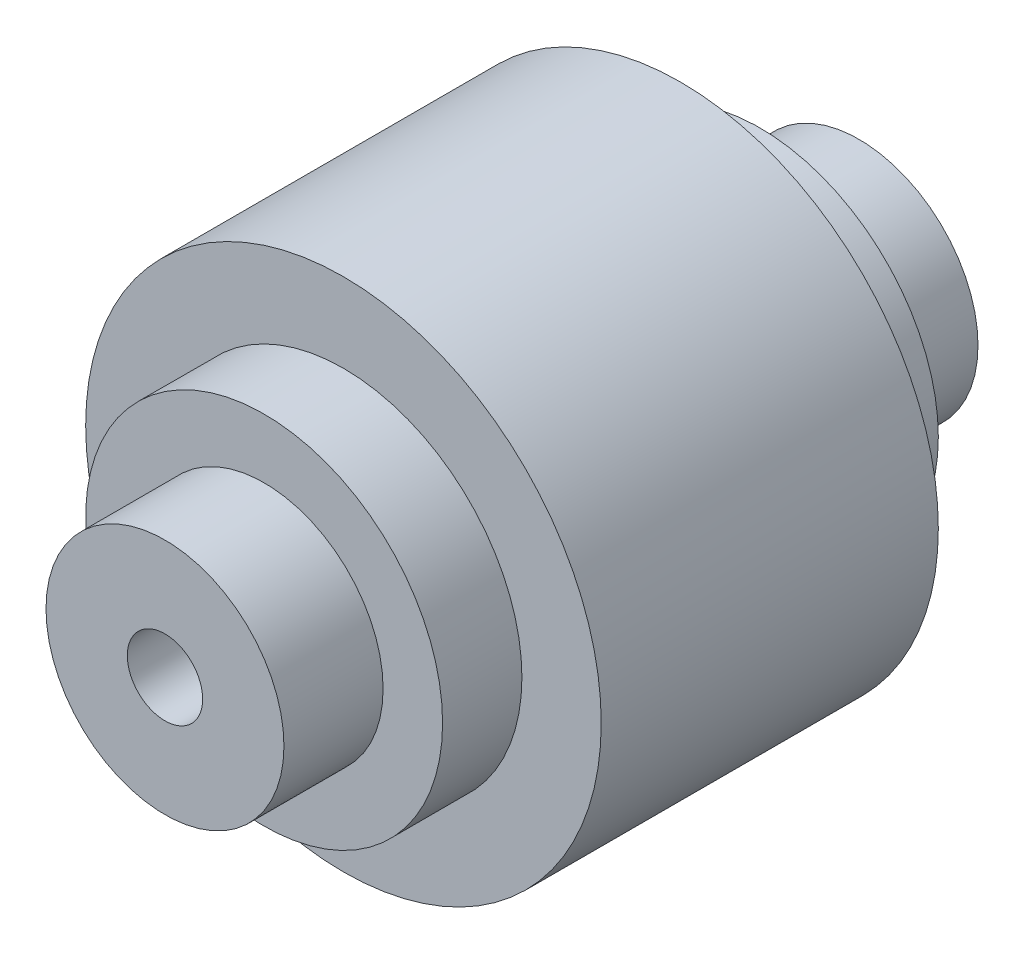
ISO-10303-21;
HEADER;
FILE_DESCRIPTION(('STEP AP214'),'2;1');
FILE_NAME('part.step','',(''),(''),'','','');
FILE_SCHEMA(('AUTOMOTIVE_DESIGN { 1 0 10303 214 1 1 1 1 }'));
ENDSEC;
DATA;
#1=APPLICATION_CONTEXT('core data for automotive mechanical design processes');
#2=APPLICATION_PROTOCOL_DEFINITION('international standard','automotive_design',2000,#1);
#3=PRODUCT_CONTEXT('',#1,'mechanical');
#4=PRODUCT('Part','Part','',(#3));
#5=PRODUCT_RELATED_PRODUCT_CATEGORY('part','',(#4));
#6=PRODUCT_DEFINITION_FORMATION('','',#4);
#7=PRODUCT_DEFINITION_CONTEXT('part definition',#1,'design');
#8=PRODUCT_DEFINITION('design','',#6,#7);
#9=PRODUCT_DEFINITION_SHAPE('','',#8);
#10=(LENGTH_UNIT() NAMED_UNIT(*) SI_UNIT(.MILLI.,.METRE.));
#11=(NAMED_UNIT(*) PLANE_ANGLE_UNIT() SI_UNIT($,.RADIAN.));
#12=(NAMED_UNIT(*) SI_UNIT($,.STERADIAN.) SOLID_ANGLE_UNIT());
#13=UNCERTAINTY_MEASURE_WITH_UNIT(LENGTH_MEASURE(1.E-05),#10,'distance_accuracy_value','');
#14=(GEOMETRIC_REPRESENTATION_CONTEXT(3) GLOBAL_UNCERTAINTY_ASSIGNED_CONTEXT((#13)) GLOBAL_UNIT_ASSIGNED_CONTEXT((#10,
#11,#12)) REPRESENTATION_CONTEXT('',''));
#15=CARTESIAN_POINT('',(0.,0.,0.));
#16=DIRECTION('',(0.,0.,1.));
#17=DIRECTION('',(1.,0.,0.));
#18=AXIS2_PLACEMENT_3D('',#15,#16,#17);
#19=CARTESIAN_POINT('',(6.00000000000001,0.,35.0000000000258));
#20=DIRECTION('',(0.,0.,-1.));
#21=DIRECTION('',(-1.,0.,0.));
#22=AXIS2_PLACEMENT_3D('',#19,#20,#21);
#23=PLANE('',#22);
#24=CARTESIAN_POINT('',(0.,0.,35.0000000000258));
#25=DIRECTION('',(0.,0.,1.));
#26=DIRECTION('',(1.,0.,0.));
#27=AXIS2_PLACEMENT_3D('',#24,#25,#26);
#28=CIRCLE('',#27,1.9);
#29=CARTESIAN_POINT('',(1.9,0.,35.0000000000258));
#30=VERTEX_POINT('',#29);
#31=EDGE_CURVE('E69',#30,#30,#28,.T.);
#32=ORIENTED_EDGE('',*,*,#31,.F.);
#33=EDGE_LOOP('',(#32));
#34=FACE_BOUND('',#33,.T.);
#35=CARTESIAN_POINT('',(0.,0.,35.0000000000258));
#36=DIRECTION('',(0.,0.,-1.));
#37=DIRECTION('',(-1.,0.,0.));
#38=AXIS2_PLACEMENT_3D('',#35,#36,#37);
#39=CIRCLE('',#38,5.99999999999999);
#40=CARTESIAN_POINT('',(-5.99999999999998,0.,35.0000000000258));
#41=VERTEX_POINT('',#40);
#42=EDGE_CURVE('E41',#41,#41,#39,.T.);
#43=ORIENTED_EDGE('',*,*,#42,.F.);
#44=EDGE_LOOP('',(#43));
#45=FACE_BOUND('',#44,.T.);
#46=ADVANCED_FACE('F33',(#34,#45),#23,.F.);
#47=CARTESIAN_POINT('',(0.,0.,7.69072305839558E-10));
#48=DIRECTION('',(0.,0.,-1.));
#49=DIRECTION('',(-1.,0.,0.));
#50=AXIS2_PLACEMENT_3D('',#47,#48,#49);
#51=CYLINDRICAL_SURFACE('',#50,5.99999999999999);
#52=CARTESIAN_POINT('',(0.,0.,30.0000000003974));
#53=DIRECTION('',(0.,0.,-1.));
#54=DIRECTION('',(-1.,0.,0.));
#55=AXIS2_PLACEMENT_3D('',#52,#53,#54);
#56=CIRCLE('',#55,5.99999999999999);
#57=CARTESIAN_POINT('',(-5.99999999999998,0.,30.0000000003974));
#58=VERTEX_POINT('',#57);
#59=EDGE_CURVE('E45',#58,#58,#56,.T.);
#60=ORIENTED_EDGE('',*,*,#59,.F.);
#61=EDGE_LOOP('',(#60));
#62=FACE_BOUND('',#61,.T.);
#63=ORIENTED_EDGE('',*,*,#42,.T.);
#64=EDGE_LOOP('',(#63));
#65=FACE_BOUND('',#64,.T.);
#66=ADVANCED_FACE('F111',(#62,#65),#51,.T.);
#67=CARTESIAN_POINT('',(7.50000000000001,0.,30.0000000003974));
#68=DIRECTION('',(0.,0.,-1.));
#69=DIRECTION('',(-1.,0.,0.));
#70=AXIS2_PLACEMENT_3D('',#67,#68,#69);
#71=PLANE('',#70);
#72=ORIENTED_EDGE('',*,*,#59,.T.);
#73=EDGE_LOOP('',(#72));
#74=FACE_BOUND('',#73,.T.);
#75=CARTESIAN_POINT('',(0.,0.,30.0000000003974));
#76=DIRECTION('',(0.,0.,1.));
#77=DIRECTION('',(1.,0.,0.));
#78=AXIS2_PLACEMENT_3D('',#75,#76,#77);
#79=CIRCLE('',#78,9.);
#80=CARTESIAN_POINT('',(9.,0.,30.0000000003974));
#81=VERTEX_POINT('',#80);
#82=EDGE_CURVE('E77',#81,#81,#79,.T.);
#83=ORIENTED_EDGE('',*,*,#82,.T.);
#84=EDGE_LOOP('',(#83));
#85=FACE_BOUND('',#84,.T.);
#86=ADVANCED_FACE('F81',(#74,#85),#71,.F.);
#87=CARTESIAN_POINT('',(0.,0.,-0.999999999974265));
#88=DIRECTION('',(0.,0.,1.));
#89=DIRECTION('',(1.,0.,0.));
#90=AXIS2_PLACEMENT_3D('',#87,#88,#89);
#91=CYLINDRICAL_SURFACE('',#90,1.9);
#92=CARTESIAN_POINT('',(0.,0.,30.0000000003974));
#93=DIRECTION('',(0.,0.,1.));
#94=DIRECTION('',(1.,0.,0.));
#95=AXIS2_PLACEMENT_3D('',#92,#93,#94);
#96=CIRCLE('',#95,1.9);
#97=CARTESIAN_POINT('',(1.9,0.,30.0000000003974));
#98=VERTEX_POINT('',#97);
#99=EDGE_CURVE('E48',#98,#98,#96,.F.);
#100=ORIENTED_EDGE('',*,*,#99,.T.);
#101=EDGE_LOOP('',(#100));
#102=FACE_BOUND('',#101,.T.);
#103=ORIENTED_EDGE('',*,*,#31,.T.);
#104=EDGE_LOOP('',(#103));
#105=FACE_BOUND('',#104,.T.);
#106=ADVANCED_FACE('F123',(#102,#105),#91,.F.);
#107=CARTESIAN_POINT('',(0.,0.,30.0000000003974));
#108=DIRECTION('',(0.,0.,1.));
#109=DIRECTION('',(1.,0.,0.));
#110=AXIS2_PLACEMENT_3D('',#107,#108,#109);
#111=PLANE('',#110);
#112=ORIENTED_EDGE('',*,*,#99,.F.);
#113=EDGE_LOOP('',(#112));
#114=FACE_BOUND('',#113,.T.);
#115=ADVANCED_FACE('F87',(#114),#111,.T.);
#116=CARTESIAN_POINT('',(0.,0.,5.00000000039737));
#117=DIRECTION('',(0.,0.,1.));
#118=DIRECTION('',(1.,0.,0.));
#119=AXIS2_PLACEMENT_3D('',#116,#117,#118);
#120=CYLINDRICAL_SURFACE('',#119,9.);
#121=ORIENTED_EDGE('',*,*,#82,.F.);
#122=EDGE_LOOP('',(#121));
#123=FACE_BOUND('',#122,.T.);
#124=CARTESIAN_POINT('',(0.,0.,26.0000000003974));
#125=DIRECTION('',(0.,0.,-1.));
#126=DIRECTION('',(-1.,0.,0.));
#127=AXIS2_PLACEMENT_3D('',#124,#125,#126);
#128=CIRCLE('',#127,9.);
#129=CARTESIAN_POINT('',(-9.,0.,26.0000000003974));
#130=VERTEX_POINT('',#129);
#131=EDGE_CURVE('E72',#130,#130,#128,.T.);
#132=ORIENTED_EDGE('',*,*,#131,.F.);
#133=EDGE_LOOP('',(#132));
#134=FACE_BOUND('',#133,.T.);
#135=ADVANCED_FACE('F83',(#123,#134),#120,.T.);
#136=CARTESIAN_POINT('',(9.00000000000001,0.,26.0000000003974));
#137=DIRECTION('',(0.,0.,-1.));
#138=DIRECTION('',(-1.,0.,0.));
#139=AXIS2_PLACEMENT_3D('',#136,#137,#138);
#140=PLANE('',#139);
#141=ORIENTED_EDGE('',*,*,#131,.T.);
#142=EDGE_LOOP('',(#141));
#143=FACE_BOUND('',#142,.T.);
#144=CARTESIAN_POINT('',(0.,0.,26.0000000003974));
#145=DIRECTION('',(0.,0.,-1.));
#146=DIRECTION('',(-1.,0.,0.));
#147=AXIS2_PLACEMENT_3D('',#144,#145,#146);
#148=CIRCLE('',#147,13.);
#149=CARTESIAN_POINT('',(-13.,0.,26.0000000003974));
#150=VERTEX_POINT('',#149);
#151=EDGE_CURVE('E54',#150,#150,#148,.T.);
#152=ORIENTED_EDGE('',*,*,#151,.F.);
#153=EDGE_LOOP('',(#152));
#154=FACE_BOUND('',#153,.T.);
#155=ADVANCED_FACE('F86',(#143,#154),#140,.F.);
#156=CARTESIAN_POINT('',(0.,0.,7.69072305839558E-10));
#157=DIRECTION('',(0.,0.,-1.));
#158=DIRECTION('',(-1.,0.,0.));
#159=AXIS2_PLACEMENT_3D('',#156,#157,#158);
#160=CYLINDRICAL_SURFACE('',#159,13.);
#161=CARTESIAN_POINT('',(0.,0.,9.00000000039744));
#162=DIRECTION('',(0.,0.,-1.));
#163=DIRECTION('',(-1.,0.,0.));
#164=AXIS2_PLACEMENT_3D('',#161,#162,#163);
#165=CIRCLE('',#164,13.);
#166=CARTESIAN_POINT('',(-13.,0.,9.00000000039744));
#167=VERTEX_POINT('',#166);
#168=EDGE_CURVE('E57',#167,#167,#165,.T.);
#169=ORIENTED_EDGE('',*,*,#168,.F.);
#170=EDGE_LOOP('',(#169));
#171=FACE_BOUND('',#170,.T.);
#172=ORIENTED_EDGE('',*,*,#151,.T.);
#173=EDGE_LOOP('',(#172));
#174=FACE_BOUND('',#173,.T.);
#175=ADVANCED_FACE('F94',(#171,#174),#160,.T.);
#176=CARTESIAN_POINT('',(9.00000000000001,0.,9.00000000039745));
#177=DIRECTION('',(0.,0.,1.));
#178=DIRECTION('',(1.,0.,0.));
#179=AXIS2_PLACEMENT_3D('',#176,#177,#178);
#180=PLANE('',#179);
#181=CARTESIAN_POINT('',(0.,0.,9.00000000039745));
#182=DIRECTION('',(0.,0.,1.));
#183=DIRECTION('',(1.,0.,0.));
#184=AXIS2_PLACEMENT_3D('',#181,#182,#183);
#185=CIRCLE('',#184,9.);
#186=CARTESIAN_POINT('',(9.,0.,9.00000000039745));
#187=VERTEX_POINT('',#186);
#188=EDGE_CURVE('E37',#187,#187,#185,.T.);
#189=ORIENTED_EDGE('',*,*,#188,.T.);
#190=EDGE_LOOP('',(#189));
#191=FACE_BOUND('',#190,.T.);
#192=ORIENTED_EDGE('',*,*,#168,.T.);
#193=EDGE_LOOP('',(#192));
#194=FACE_BOUND('',#193,.T.);
#195=ADVANCED_FACE('F99',(#191,#194),#180,.F.);
#196=CARTESIAN_POINT('',(0.,0.,5.00000000039737));
#197=DIRECTION('',(0.,0.,1.));
#198=DIRECTION('',(1.,0.,0.));
#199=AXIS2_PLACEMENT_3D('',#196,#197,#198);
#200=CIRCLE('',#199,9.);
#201=CARTESIAN_POINT('',(9.,0.,5.00000000039737));
#202=VERTEX_POINT('',#201);
#203=EDGE_CURVE('E50',#202,#202,#200,.T.);
#204=ORIENTED_EDGE('',*,*,#203,.T.);
#205=EDGE_LOOP('',(#204));
#206=FACE_BOUND('',#205,.T.);
#207=ORIENTED_EDGE('',*,*,#188,.F.);
#208=EDGE_LOOP('',(#207));
#209=FACE_BOUND('',#208,.T.);
#210=ADVANCED_FACE('F89',(#206,#209),#120,.T.);
#211=CARTESIAN_POINT('',(6.00000000000001,0.,7.69072305839558E-10));
#212=DIRECTION('',(0.,0.,1.));
#213=DIRECTION('',(1.,0.,0.));
#214=AXIS2_PLACEMENT_3D('',#211,#212,#213);
#215=PLANE('',#214);
#216=CARTESIAN_POINT('',(0.,0.,7.69072305839558E-10));
#217=DIRECTION('',(0.,0.,1.));
#218=DIRECTION('',(1.,0.,0.));
#219=AXIS2_PLACEMENT_3D('',#216,#217,#218);
#220=CIRCLE('',#219,1.9);
#221=CARTESIAN_POINT('',(1.9,0.,7.69072305839558E-10));
#222=VERTEX_POINT('',#221);
#223=EDGE_CURVE('E66',#222,#222,#220,.T.);
#224=ORIENTED_EDGE('',*,*,#223,.T.);
#225=EDGE_LOOP('',(#224));
#226=FACE_BOUND('',#225,.T.);
#227=CARTESIAN_POINT('',(0.,0.,7.69072305839558E-10));
#228=DIRECTION('',(0.,0.,-1.));
#229=DIRECTION('',(-1.,0.,0.));
#230=AXIS2_PLACEMENT_3D('',#227,#228,#229);
#231=CIRCLE('',#230,5.99999999999999);
#232=CARTESIAN_POINT('',(-5.99999999999998,0.,7.69072305839558E-10));
#233=VERTEX_POINT('',#232);
#234=EDGE_CURVE('E63',#233,#233,#231,.T.);
#235=ORIENTED_EDGE('',*,*,#234,.T.);
#236=EDGE_LOOP('',(#235));
#237=FACE_BOUND('',#236,.T.);
#238=ADVANCED_FACE('F35',(#226,#237),#215,.F.);
#239=ORIENTED_EDGE('',*,*,#223,.F.);
#240=EDGE_LOOP('',(#239));
#241=FACE_BOUND('',#240,.T.);
#242=CARTESIAN_POINT('',(0.,0.,5.00000000039737));
#243=DIRECTION('',(0.,0.,1.));
#244=DIRECTION('',(1.,0.,0.));
#245=AXIS2_PLACEMENT_3D('',#242,#243,#244);
#246=CIRCLE('',#245,1.9);
#247=CARTESIAN_POINT('',(1.9,0.,5.00000000039737));
#248=VERTEX_POINT('',#247);
#249=EDGE_CURVE('E10',#248,#248,#246,.F.);
#250=ORIENTED_EDGE('',*,*,#249,.F.);
#251=EDGE_LOOP('',(#250));
#252=FACE_BOUND('',#251,.T.);
#253=ADVANCED_FACE('F132',(#241,#252),#91,.F.);
#254=CARTESIAN_POINT('',(0.,0.,7.69072305839558E-10));
#255=DIRECTION('',(0.,0.,-1.));
#256=DIRECTION('',(-1.,0.,0.));
#257=AXIS2_PLACEMENT_3D('',#254,#255,#256);
#258=CYLINDRICAL_SURFACE('',#257,5.99999999999999);
#259=ORIENTED_EDGE('',*,*,#234,.F.);
#260=EDGE_LOOP('',(#259));
#261=FACE_BOUND('',#260,.T.);
#262=CARTESIAN_POINT('',(0.,0.,5.00000000039745));
#263=DIRECTION('',(0.,0.,-1.));
#264=DIRECTION('',(-1.,0.,0.));
#265=AXIS2_PLACEMENT_3D('',#262,#263,#264);
#266=CIRCLE('',#265,5.99999999999999);
#267=CARTESIAN_POINT('',(-5.99999999999998,0.,5.00000000039745));
#268=VERTEX_POINT('',#267);
#269=EDGE_CURVE('E60',#268,#268,#266,.T.);
#270=ORIENTED_EDGE('',*,*,#269,.T.);
#271=EDGE_LOOP('',(#270));
#272=FACE_BOUND('',#271,.T.);
#273=ADVANCED_FACE('F144',(#261,#272),#258,.T.);
#274=CARTESIAN_POINT('',(7.50000000000001,0.,5.00000000039745));
#275=DIRECTION('',(0.,0.,1.));
#276=DIRECTION('',(1.,0.,0.));
#277=AXIS2_PLACEMENT_3D('',#274,#275,#276);
#278=PLANE('',#277);
#279=ORIENTED_EDGE('',*,*,#269,.F.);
#280=EDGE_LOOP('',(#279));
#281=FACE_BOUND('',#280,.T.);
#282=ORIENTED_EDGE('',*,*,#203,.F.);
#283=EDGE_LOOP('',(#282));
#284=FACE_BOUND('',#283,.T.);
#285=ADVANCED_FACE('F150',(#281,#284),#278,.F.);
#286=CARTESIAN_POINT('',(0.,0.,5.00000000039737));
#287=DIRECTION('',(0.,0.,1.));
#288=DIRECTION('',(1.,0.,0.));
#289=AXIS2_PLACEMENT_3D('',#286,#287,#288);
#290=PLANE('',#289);
#291=ORIENTED_EDGE('',*,*,#249,.T.);
#292=EDGE_LOOP('',(#291));
#293=FACE_BOUND('',#292,.T.);
#294=ADVANCED_FACE('F162',(#293),#290,.F.);
#295=CLOSED_SHELL('',(#46,#66,#86,#106,#115,#135,#155,#175,#195,#210,#238,#253,#273,#285,#294));
#296=MANIFOLD_SOLID_BREP('B2',#295);
#297=ADVANCED_BREP_SHAPE_REPRESENTATION('',(#18,#296),#14);
#298=SHAPE_DEFINITION_REPRESENTATION(#9,#297);
ENDSEC;
END-ISO-10303-21;
